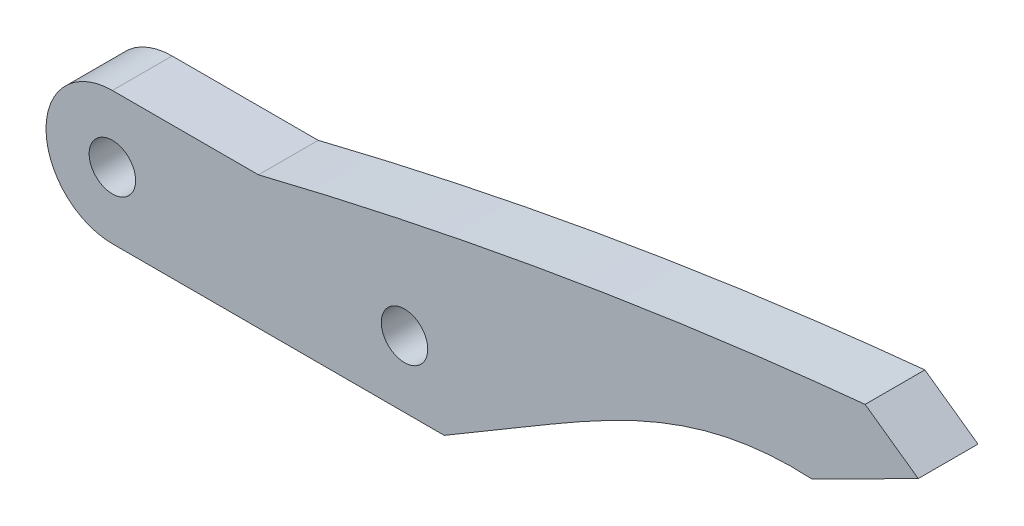
ISO-10303-21;
HEADER;
FILE_DESCRIPTION(('STEP AP214'),'2;1');
FILE_NAME('part.step','',(''),(''),'','','');
FILE_SCHEMA(('AUTOMOTIVE_DESIGN { 1 0 10303 214 1 1 1 1 }'));
ENDSEC;
DATA;
#1=APPLICATION_CONTEXT('core data for automotive mechanical design processes');
#2=APPLICATION_PROTOCOL_DEFINITION('international standard','automotive_design',2000,#1);
#3=PRODUCT_CONTEXT('',#1,'mechanical');
#4=PRODUCT('Part','Part','',(#3));
#5=PRODUCT_RELATED_PRODUCT_CATEGORY('part','',(#4));
#6=PRODUCT_DEFINITION_FORMATION('','',#4);
#7=PRODUCT_DEFINITION_CONTEXT('part definition',#1,'design');
#8=PRODUCT_DEFINITION('design','',#6,#7);
#9=PRODUCT_DEFINITION_SHAPE('','',#8);
#10=(LENGTH_UNIT() NAMED_UNIT(*) SI_UNIT(.MILLI.,.METRE.));
#11=(NAMED_UNIT(*) PLANE_ANGLE_UNIT() SI_UNIT($,.RADIAN.));
#12=(NAMED_UNIT(*) SI_UNIT($,.STERADIAN.) SOLID_ANGLE_UNIT());
#13=UNCERTAINTY_MEASURE_WITH_UNIT(LENGTH_MEASURE(1.E-05),#10,'distance_accuracy_value','');
#14=(GEOMETRIC_REPRESENTATION_CONTEXT(3) GLOBAL_UNCERTAINTY_ASSIGNED_CONTEXT((#13)) GLOBAL_UNIT_ASSIGNED_CONTEXT((#10,
#11,#12)) REPRESENTATION_CONTEXT('',''));
#15=CARTESIAN_POINT('',(0.,0.,0.));
#16=DIRECTION('',(0.,0.,1.));
#17=DIRECTION('',(1.,0.,0.));
#18=AXIS2_PLACEMENT_3D('',#15,#16,#17);
#19=CARTESIAN_POINT('',(0.,5.,4.5));
#20=DIRECTION('',(0.,1.,0.));
#21=DIRECTION('',(0.,0.,1.));
#22=AXIS2_PLACEMENT_3D('',#19,#20,#21);
#23=PLANE('',#22);
#24=DIRECTION('',(1.,0.,0.));
#25=VECTOR('',#24,1.);
#26=CARTESIAN_POINT('',(0.,5.,4.5));
#27=LINE('',#26,#25);
#28=CARTESIAN_POINT('',(-11.,5.,4.5));
#29=VERTEX_POINT('',#28);
#30=CARTESIAN_POINT('',(0.,5.,4.5));
#31=VERTEX_POINT('',#30);
#32=EDGE_CURVE('E196',#29,#31,#27,.T.);
#33=ORIENTED_EDGE('',*,*,#32,.T.);
#34=DIRECTION('',(0.,0.,1.));
#35=VECTOR('',#34,1.);
#36=CARTESIAN_POINT('',(0.,5.,0.));
#37=LINE('',#36,#35);
#38=CARTESIAN_POINT('',(0.,5.,0.));
#39=VERTEX_POINT('',#38);
#40=EDGE_CURVE('E185',#39,#31,#37,.T.);
#41=ORIENTED_EDGE('',*,*,#40,.F.);
#42=DIRECTION('',(1.,0.,0.));
#43=VECTOR('',#42,1.);
#44=CARTESIAN_POINT('',(0.,5.,0.));
#45=LINE('',#44,#43);
#46=CARTESIAN_POINT('',(-11.,5.,0.));
#47=VERTEX_POINT('',#46);
#48=EDGE_CURVE('E207',#47,#39,#45,.T.);
#49=ORIENTED_EDGE('',*,*,#48,.F.);
#50=DIRECTION('',(0.,0.,-1.));
#51=VECTOR('',#50,1.);
#52=CARTESIAN_POINT('',(-11.,5.,4.5));
#53=LINE('',#52,#51);
#54=EDGE_CURVE('E50',#29,#47,#53,.T.);
#55=ORIENTED_EDGE('',*,*,#54,.F.);
#56=EDGE_LOOP('',(#33,#41,#49,#55));
#57=FACE_BOUND('',#56,.T.);
#58=ADVANCED_FACE('F41',(#57),#23,.T.);
#59=CARTESIAN_POINT('',(-11.,0.,4.5));
#60=DIRECTION('',(0.,0.,-1.));
#61=DIRECTION('',(-1.,0.,0.));
#62=AXIS2_PLACEMENT_3D('',#59,#60,#61);
#63=CYLINDRICAL_SURFACE('',#62,5.);
#64=CARTESIAN_POINT('',(-11.,0.,0.));
#65=DIRECTION('',(0.,0.,1.));
#66=DIRECTION('',(1.,0.,0.));
#67=AXIS2_PLACEMENT_3D('',#64,#65,#66);
#68=CIRCLE('',#67,5.);
#69=CARTESIAN_POINT('',(-11.,-5.,0.));
#70=VERTEX_POINT('',#69);
#71=EDGE_CURVE('E203',#47,#70,#68,.T.);
#72=ORIENTED_EDGE('',*,*,#71,.T.);
#73=DIRECTION('',(0.,0.,-1.));
#74=VECTOR('',#73,1.);
#75=CARTESIAN_POINT('',(-11.,-5.,4.5));
#76=LINE('',#75,#74);
#77=CARTESIAN_POINT('',(-11.,-5.,4.5));
#78=VERTEX_POINT('',#77);
#79=EDGE_CURVE('E11',#78,#70,#76,.T.);
#80=ORIENTED_EDGE('',*,*,#79,.F.);
#81=CARTESIAN_POINT('',(-11.,0.,4.5));
#82=DIRECTION('',(0.,0.,1.));
#83=DIRECTION('',(1.,0.,0.));
#84=AXIS2_PLACEMENT_3D('',#81,#82,#83);
#85=CIRCLE('',#84,5.);
#86=EDGE_CURVE('E190',#29,#78,#85,.T.);
#87=ORIENTED_EDGE('',*,*,#86,.F.);
#88=ORIENTED_EDGE('',*,*,#54,.T.);
#89=EDGE_LOOP('',(#72,#80,#87,#88));
#90=FACE_BOUND('',#89,.T.);
#91=ADVANCED_FACE('F211',(#90),#63,.T.);
#92=CARTESIAN_POINT('',(0.,-5.,4.5));
#93=DIRECTION('',(0.,1.,0.));
#94=DIRECTION('',(0.,0.,1.));
#95=AXIS2_PLACEMENT_3D('',#92,#93,#94);
#96=PLANE('',#95);
#97=DIRECTION('',(1.,0.,0.));
#98=VECTOR('',#97,1.);
#99=CARTESIAN_POINT('',(0.,-5.,0.));
#100=LINE('',#99,#98);
#101=CARTESIAN_POINT('',(13.99,-5.,0.));
#102=VERTEX_POINT('',#101);
#103=EDGE_CURVE('E69',#70,#102,#100,.T.);
#104=ORIENTED_EDGE('',*,*,#103,.T.);
#105=DIRECTION('',(0.,0.,1.));
#106=VECTOR('',#105,1.);
#107=CARTESIAN_POINT('',(13.99,-5.,0.));
#108=LINE('',#107,#106);
#109=CARTESIAN_POINT('',(13.99,-5.,4.5));
#110=VERTEX_POINT('',#109);
#111=EDGE_CURVE('E182',#102,#110,#108,.T.);
#112=ORIENTED_EDGE('',*,*,#111,.T.);
#113=DIRECTION('',(1.,0.,0.));
#114=VECTOR('',#113,1.);
#115=CARTESIAN_POINT('',(0.,-5.,4.5));
#116=LINE('',#115,#114);
#117=EDGE_CURVE('E194',#78,#110,#116,.T.);
#118=ORIENTED_EDGE('',*,*,#117,.F.);
#119=ORIENTED_EDGE('',*,*,#79,.T.);
#120=EDGE_LOOP('',(#104,#112,#118,#119));
#121=FACE_BOUND('',#120,.T.);
#122=ADVANCED_FACE('F234',(#121),#96,.F.);
#123=CARTESIAN_POINT('',(-11.,0.,4.5));
#124=DIRECTION('',(0.,0.,-1.));
#125=DIRECTION('',(-1.,0.,0.));
#126=AXIS2_PLACEMENT_3D('',#123,#124,#125);
#127=CYLINDRICAL_SURFACE('',#126,1.75);
#128=CARTESIAN_POINT('',(-11.,0.,4.5));
#129=DIRECTION('',(0.,0.,1.));
#130=DIRECTION('',(1.,0.,0.));
#131=AXIS2_PLACEMENT_3D('',#128,#129,#130);
#132=CIRCLE('',#131,1.75);
#133=CARTESIAN_POINT('',(-9.25,0.,4.5));
#134=VERTEX_POINT('',#133);
#135=EDGE_CURVE('E187',#134,#134,#132,.T.);
#136=ORIENTED_EDGE('',*,*,#135,.T.);
#137=EDGE_LOOP('',(#136));
#138=FACE_BOUND('',#137,.T.);
#139=CARTESIAN_POINT('',(-11.,0.,0.));
#140=DIRECTION('',(0.,0.,1.));
#141=DIRECTION('',(1.,0.,0.));
#142=AXIS2_PLACEMENT_3D('',#139,#140,#141);
#143=CIRCLE('',#142,1.75);
#144=CARTESIAN_POINT('',(-9.25,0.,0.));
#145=VERTEX_POINT('',#144);
#146=EDGE_CURVE('E179',#145,#145,#143,.T.);
#147=ORIENTED_EDGE('',*,*,#146,.F.);
#148=EDGE_LOOP('',(#147));
#149=FACE_BOUND('',#148,.T.);
#150=ADVANCED_FACE('F43',(#138,#149),#127,.F.);
#151=CARTESIAN_POINT('',(11.,0.,4.5));
#152=DIRECTION('',(0.,0.,-1.));
#153=DIRECTION('',(-1.,0.,0.));
#154=AXIS2_PLACEMENT_3D('',#151,#152,#153);
#155=CYLINDRICAL_SURFACE('',#154,1.75);
#156=CARTESIAN_POINT('',(11.,0.,4.5));
#157=DIRECTION('',(0.,0.,1.));
#158=DIRECTION('',(1.,0.,0.));
#159=AXIS2_PLACEMENT_3D('',#156,#157,#158);
#160=CIRCLE('',#159,1.75);
#161=CARTESIAN_POINT('',(12.75,0.,4.5));
#162=VERTEX_POINT('',#161);
#163=EDGE_CURVE('E198',#162,#162,#160,.T.);
#164=ORIENTED_EDGE('',*,*,#163,.T.);
#165=EDGE_LOOP('',(#164));
#166=FACE_BOUND('',#165,.T.);
#167=CARTESIAN_POINT('',(11.,0.,0.));
#168=DIRECTION('',(0.,0.,1.));
#169=DIRECTION('',(1.,0.,0.));
#170=AXIS2_PLACEMENT_3D('',#167,#168,#169);
#171=CIRCLE('',#170,1.75);
#172=CARTESIAN_POINT('',(12.75,0.,0.));
#173=VERTEX_POINT('',#172);
#174=EDGE_CURVE('E191',#173,#173,#171,.T.);
#175=ORIENTED_EDGE('',*,*,#174,.F.);
#176=EDGE_LOOP('',(#175));
#177=FACE_BOUND('',#176,.T.);
#178=ADVANCED_FACE('F242',(#166,#177),#155,.F.);
#179=CARTESIAN_POINT('',(0.,0.,4.5));
#180=DIRECTION('',(0.,0.,1.));
#181=DIRECTION('',(1.,0.,0.));
#182=AXIS2_PLACEMENT_3D('',#179,#180,#181);
#183=PLANE('',#182);
#184=ORIENTED_EDGE('',*,*,#135,.F.);
#185=EDGE_LOOP('',(#184));
#186=FACE_BOUND('',#185,.T.);
#187=ORIENTED_EDGE('',*,*,#86,.T.);
#188=ORIENTED_EDGE('',*,*,#117,.T.);
#189=DIRECTION('',(-0.860747110824981,-0.509032819380488,0.));
#190=VECTOR('',#189,1.);
#191=CARTESIAN_POINT('',(5.81575325576245,-9.83412585903768,4.5));
#192=LINE('',#191,#190);
#193=CARTESIAN_POINT('',(19.9421306185942,-1.48,4.5));
#194=VERTEX_POINT('',#193);
#195=EDGE_CURVE('E217',#194,#110,#192,.T.);
#196=ORIENTED_EDGE('',*,*,#195,.F.);
#197=CARTESIAN_POINT('',(41.6889703313748,6.,4.5));
#198=CARTESIAN_POINT('',(33.2855209432187,6.45947607144246,4.5));
#199=CARTESIAN_POINT('',(26.9183977304863,2.64565882831044,4.5));
#200=CARTESIAN_POINT('',(19.9421306185942,-1.48,4.5));
#201=B_SPLINE_CURVE_WITH_KNOTS('',3,(#197,#198,#199,#200),.UNSPECIFIED.,.F.,.F.,(4,4),(0.,1.),.UNSPECIFIED.);
#202=CARTESIAN_POINT('',(41.6889703313748,6.,4.5));
#203=VERTEX_POINT('',#202);
#204=EDGE_CURVE('E173',#203,#194,#201,.T.);
#205=ORIENTED_EDGE('',*,*,#204,.F.);
#206=DIRECTION('',(-0.893083552822981,-0.449890839734577,0.));
#207=VECTOR('',#206,1.);
#208=CARTESIAN_POINT('',(6.02718063051168,-11.9646265618098,4.5));
#209=LINE('',#208,#207);
#210=CARTESIAN_POINT('',(49.6889703313748,10.03,4.5));
#211=VERTEX_POINT('',#210);
#212=EDGE_CURVE('E130',#211,#203,#209,.T.);
#213=ORIENTED_EDGE('',*,*,#212,.F.);
#214=DIRECTION('',(0.815382984620277,-0.578921919080397,0.));
#215=VECTOR('',#214,1.);
#216=CARTESIAN_POINT('',(21.3878797580254,30.123774307078,4.5));
#217=LINE('',#216,#215);
#218=CARTESIAN_POINT('',(45.6889703313748,12.87,4.5));
#219=VERTEX_POINT('',#218);
#220=EDGE_CURVE('E103',#219,#211,#217,.T.);
#221=ORIENTED_EDGE('',*,*,#220,.F.);
#222=CARTESIAN_POINT('',(0.,5.,4.5));
#223=CARTESIAN_POINT('',(22.5642640407895,10.5902612976692,4.5));
#224=CARTESIAN_POINT('',(45.6889703313748,12.87,4.5));
#225=B_SPLINE_CURVE_WITH_KNOTS('',2,(#222,#223,#224),.UNSPECIFIED.,.F.,.F.,(3,3),(0.,1.),.UNSPECIFIED.);
#226=EDGE_CURVE('E215',#31,#219,#225,.T.);
#227=ORIENTED_EDGE('',*,*,#226,.F.);
#228=ORIENTED_EDGE('',*,*,#32,.F.);
#229=EDGE_LOOP('',(#187,#188,#196,#205,#213,#221,#227,#228));
#230=FACE_BOUND('',#229,.T.);
#231=ORIENTED_EDGE('',*,*,#163,.F.);
#232=EDGE_LOOP('',(#231));
#233=FACE_BOUND('',#232,.T.);
#234=ADVANCED_FACE('F163',(#186,#230,#233),#183,.T.);
#235=CARTESIAN_POINT('',(0.,0.,0.));
#236=DIRECTION('',(0.,0.,1.));
#237=DIRECTION('',(1.,0.,0.));
#238=AXIS2_PLACEMENT_3D('',#235,#236,#237);
#239=PLANE('',#238);
#240=ORIENTED_EDGE('',*,*,#146,.T.);
#241=EDGE_LOOP('',(#240));
#242=FACE_BOUND('',#241,.T.);
#243=ORIENTED_EDGE('',*,*,#71,.F.);
#244=ORIENTED_EDGE('',*,*,#48,.T.);
#245=CARTESIAN_POINT('',(0.,5.,0.));
#246=CARTESIAN_POINT('',(22.5642640407895,10.5902612976692,0.));
#247=CARTESIAN_POINT('',(45.6889703313748,12.87,0.));
#248=B_SPLINE_CURVE_WITH_KNOTS('',2,(#245,#246,#247),.UNSPECIFIED.,.F.,.F.,(3,3),(0.,1.),.UNSPECIFIED.);
#249=CARTESIAN_POINT('',(45.6889703313748,12.87,0.));
#250=VERTEX_POINT('',#249);
#251=EDGE_CURVE('E109',#39,#250,#248,.T.);
#252=ORIENTED_EDGE('',*,*,#251,.T.);
#253=DIRECTION('',(0.815382984620277,-0.578921919080397,0.));
#254=VECTOR('',#253,1.);
#255=CARTESIAN_POINT('',(21.3878797580254,30.123774307078,0.));
#256=LINE('',#255,#254);
#257=CARTESIAN_POINT('',(49.6889703313748,10.03,0.));
#258=VERTEX_POINT('',#257);
#259=EDGE_CURVE('E77',#250,#258,#256,.T.);
#260=ORIENTED_EDGE('',*,*,#259,.T.);
#261=DIRECTION('',(-0.893083552822981,-0.449890839734577,0.));
#262=VECTOR('',#261,1.);
#263=CARTESIAN_POINT('',(6.02718063051168,-11.9646265618098,0.));
#264=LINE('',#263,#262);
#265=CARTESIAN_POINT('',(41.6889703313748,6.,0.));
#266=VERTEX_POINT('',#265);
#267=EDGE_CURVE('E117',#258,#266,#264,.T.);
#268=ORIENTED_EDGE('',*,*,#267,.T.);
#269=CARTESIAN_POINT('',(41.6889703313748,6.,0.));
#270=CARTESIAN_POINT('',(33.2855209432187,6.45947607144246,0.));
#271=CARTESIAN_POINT('',(26.9183977304863,2.64565882831044,0.));
#272=CARTESIAN_POINT('',(19.9421306185942,-1.48,0.));
#273=B_SPLINE_CURVE_WITH_KNOTS('',3,(#269,#270,#271,#272),.UNSPECIFIED.,.F.,.F.,(4,4),(0.,1.),.UNSPECIFIED.);
#274=CARTESIAN_POINT('',(19.9421306185942,-1.48,0.));
#275=VERTEX_POINT('',#274);
#276=EDGE_CURVE('E122',#266,#275,#273,.T.);
#277=ORIENTED_EDGE('',*,*,#276,.T.);
#278=DIRECTION('',(-0.860747110824981,-0.509032819380488,0.));
#279=VECTOR('',#278,1.);
#280=CARTESIAN_POINT('',(5.81575325576245,-9.83412585903768,0.));
#281=LINE('',#280,#279);
#282=EDGE_CURVE('E139',#275,#102,#281,.T.);
#283=ORIENTED_EDGE('',*,*,#282,.T.);
#284=ORIENTED_EDGE('',*,*,#103,.F.);
#285=EDGE_LOOP('',(#243,#244,#252,#260,#268,#277,#283,#284));
#286=FACE_BOUND('',#285,.T.);
#287=ORIENTED_EDGE('',*,*,#174,.T.);
#288=EDGE_LOOP('',(#287));
#289=FACE_BOUND('',#288,.T.);
#290=ADVANCED_FACE('F119',(#242,#286,#289),#239,.F.);
#291=DIRECTION('',(0.,0.,1.));
#292=VECTOR('',#291,1.);
#293=SURFACE_OF_LINEAR_EXTRUSION('',#248,#292);
#294=ORIENTED_EDGE('',*,*,#226,.T.);
#295=DIRECTION('',(0.,0.,1.));
#296=VECTOR('',#295,1.);
#297=CARTESIAN_POINT('',(45.6889703313748,12.87,0.));
#298=LINE('',#297,#296);
#299=EDGE_CURVE('E177',#250,#219,#298,.T.);
#300=ORIENTED_EDGE('',*,*,#299,.F.);
#301=ORIENTED_EDGE('',*,*,#251,.F.);
#302=ORIENTED_EDGE('',*,*,#40,.T.);
#303=EDGE_LOOP('',(#294,#300,#301,#302));
#304=FACE_BOUND('',#303,.T.);
#305=ADVANCED_FACE('F159',(#304),#293,.F.);
#306=CARTESIAN_POINT('',(21.3878797580254,30.123774307078,0.));
#307=DIRECTION('',(-0.578921919080397,-0.815382984620277,0.));
#308=DIRECTION('',(0.815382984620277,-0.578921919080397,0.));
#309=AXIS2_PLACEMENT_3D('',#306,#307,#308);
#310=PLANE('',#309);
#311=ORIENTED_EDGE('',*,*,#220,.T.);
#312=DIRECTION('',(0.,0.,1.));
#313=VECTOR('',#312,1.);
#314=CARTESIAN_POINT('',(49.6889703313748,10.03,0.));
#315=LINE('',#314,#313);
#316=EDGE_CURVE('E133',#258,#211,#315,.T.);
#317=ORIENTED_EDGE('',*,*,#316,.F.);
#318=ORIENTED_EDGE('',*,*,#259,.F.);
#319=ORIENTED_EDGE('',*,*,#299,.T.);
#320=EDGE_LOOP('',(#311,#317,#318,#319));
#321=FACE_BOUND('',#320,.T.);
#322=ADVANCED_FACE('F162',(#321),#310,.F.);
#323=CARTESIAN_POINT('',(6.02718063051168,-11.9646265618098,0.));
#324=DIRECTION('',(-0.449890839734577,0.89308355282298,0.));
#325=DIRECTION('',(-0.893083552822981,-0.449890839734577,0.));
#326=AXIS2_PLACEMENT_3D('',#323,#324,#325);
#327=PLANE('',#326);
#328=ORIENTED_EDGE('',*,*,#212,.T.);
#329=DIRECTION('',(0.,0.,1.));
#330=VECTOR('',#329,1.);
#331=CARTESIAN_POINT('',(41.6889703313748,6.,0.));
#332=LINE('',#331,#330);
#333=EDGE_CURVE('E128',#266,#203,#332,.T.);
#334=ORIENTED_EDGE('',*,*,#333,.F.);
#335=ORIENTED_EDGE('',*,*,#267,.F.);
#336=ORIENTED_EDGE('',*,*,#316,.T.);
#337=EDGE_LOOP('',(#328,#334,#335,#336));
#338=FACE_BOUND('',#337,.T.);
#339=ADVANCED_FACE('F129',(#338),#327,.F.);
#340=DIRECTION('',(0.,0.,1.));
#341=VECTOR('',#340,1.);
#342=SURFACE_OF_LINEAR_EXTRUSION('',#273,#341);
#343=ORIENTED_EDGE('',*,*,#204,.T.);
#344=DIRECTION('',(0.,0.,1.));
#345=VECTOR('',#344,1.);
#346=CARTESIAN_POINT('',(19.9421306185942,-1.48,0.));
#347=LINE('',#346,#345);
#348=EDGE_CURVE('E134',#275,#194,#347,.T.);
#349=ORIENTED_EDGE('',*,*,#348,.F.);
#350=ORIENTED_EDGE('',*,*,#276,.F.);
#351=ORIENTED_EDGE('',*,*,#333,.T.);
#352=EDGE_LOOP('',(#343,#349,#350,#351));
#353=FACE_BOUND('',#352,.T.);
#354=ADVANCED_FACE('F136',(#353),#342,.F.);
#355=CARTESIAN_POINT('',(5.81575325576245,-9.83412585903768,0.));
#356=DIRECTION('',(-0.509032819380488,0.860747110824981,0.));
#357=DIRECTION('',(-0.860747110824981,-0.509032819380488,0.));
#358=AXIS2_PLACEMENT_3D('',#355,#356,#357);
#359=PLANE('',#358);
#360=ORIENTED_EDGE('',*,*,#195,.T.);
#361=ORIENTED_EDGE('',*,*,#111,.F.);
#362=ORIENTED_EDGE('',*,*,#282,.F.);
#363=ORIENTED_EDGE('',*,*,#348,.T.);
#364=EDGE_LOOP('',(#360,#361,#362,#363));
#365=FACE_BOUND('',#364,.T.);
#366=ADVANCED_FACE('F154',(#365),#359,.F.);
#367=CLOSED_SHELL('',(#58,#91,#122,#150,#178,#234,#290,#305,#322,#339,#354,#366));
#368=MANIFOLD_SOLID_BREP('B2',#367);
#369=ADVANCED_BREP_SHAPE_REPRESENTATION('',(#18,#368),#14);
#370=SHAPE_DEFINITION_REPRESENTATION(#9,#369);
ENDSEC;
END-ISO-10303-21;
